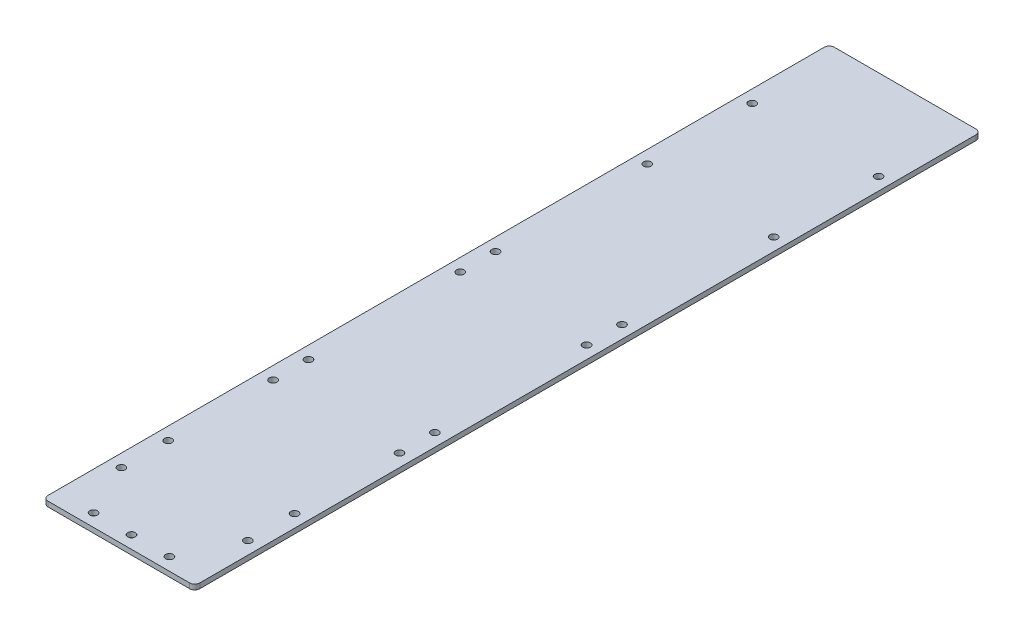
ISO-10303-21;
HEADER;
FILE_DESCRIPTION(('STEP AP214'),'2;1');
FILE_NAME('part.step','',(''),(''),'','','');
FILE_SCHEMA(('AUTOMOTIVE_DESIGN { 1 0 10303 214 1 1 1 1 }'));
ENDSEC;
DATA;
#1=APPLICATION_CONTEXT('core data for automotive mechanical design processes');
#2=APPLICATION_PROTOCOL_DEFINITION('international standard','automotive_design',2000,#1);
#3=PRODUCT_CONTEXT('',#1,'mechanical');
#4=PRODUCT('Part','Part','',(#3));
#5=PRODUCT_RELATED_PRODUCT_CATEGORY('part','',(#4));
#6=PRODUCT_DEFINITION_FORMATION('','',#4);
#7=PRODUCT_DEFINITION_CONTEXT('part definition',#1,'design');
#8=PRODUCT_DEFINITION('design','',#6,#7);
#9=PRODUCT_DEFINITION_SHAPE('','',#8);
#10=(LENGTH_UNIT() NAMED_UNIT(*) SI_UNIT(.MILLI.,.METRE.));
#11=(NAMED_UNIT(*) PLANE_ANGLE_UNIT() SI_UNIT($,.RADIAN.));
#12=(NAMED_UNIT(*) SI_UNIT($,.STERADIAN.) SOLID_ANGLE_UNIT());
#13=UNCERTAINTY_MEASURE_WITH_UNIT(LENGTH_MEASURE(1.E-05),#10,'distance_accuracy_value','');
#14=(GEOMETRIC_REPRESENTATION_CONTEXT(3) GLOBAL_UNCERTAINTY_ASSIGNED_CONTEXT((#13)) GLOBAL_UNIT_ASSIGNED_CONTEXT((#10,
#11,#12)) REPRESENTATION_CONTEXT('',''));
#15=CARTESIAN_POINT('',(0.,0.,0.));
#16=DIRECTION('',(0.,0.,1.));
#17=DIRECTION('',(1.,0.,0.));
#18=AXIS2_PLACEMENT_3D('',#15,#16,#17);
#19=CARTESIAN_POINT('',(-30.,2.,135.));
#20=DIRECTION('',(1.,0.,0.));
#21=DIRECTION('',(0.,0.,-1.));
#22=AXIS2_PLACEMENT_3D('',#19,#20,#21);
#23=PLANE('',#22);
#24=DIRECTION('',(0.,0.,1.));
#25=VECTOR('',#24,1.);
#26=CARTESIAN_POINT('',(-30.,0.,135.));
#27=LINE('',#26,#25);
#28=CARTESIAN_POINT('',(-30.,0.,-174.));
#29=VERTEX_POINT('',#28);
#30=CARTESIAN_POINT('',(-30.,0.,133.));
#31=VERTEX_POINT('',#30);
#32=EDGE_CURVE('E128',#29,#31,#27,.T.);
#33=ORIENTED_EDGE('',*,*,#32,.T.);
#34=DIRECTION('',(0.,-1.,0.));
#35=VECTOR('',#34,1.);
#36=CARTESIAN_POINT('',(-30.,2.,133.));
#37=LINE('',#36,#35);
#38=CARTESIAN_POINT('',(-30.,2.,133.));
#39=VERTEX_POINT('',#38);
#40=EDGE_CURVE('E106',#31,#39,#37,.F.);
#41=ORIENTED_EDGE('',*,*,#40,.T.);
#42=DIRECTION('',(0.,0.,1.));
#43=VECTOR('',#42,1.);
#44=CARTESIAN_POINT('',(-30.,2.,135.));
#45=LINE('',#44,#43);
#46=CARTESIAN_POINT('',(-30.,2.,-174.));
#47=VERTEX_POINT('',#46);
#48=EDGE_CURVE('E138',#47,#39,#45,.T.);
#49=ORIENTED_EDGE('',*,*,#48,.F.);
#50=DIRECTION('',(0.,-1.,0.));
#51=VECTOR('',#50,1.);
#52=CARTESIAN_POINT('',(-30.,2.,-174.));
#53=LINE('',#52,#51);
#54=EDGE_CURVE('E111',#47,#29,#53,.T.);
#55=ORIENTED_EDGE('',*,*,#54,.T.);
#56=EDGE_LOOP('',(#33,#41,#49,#55));
#57=FACE_BOUND('',#56,.T.);
#58=ADVANCED_FACE('F35',(#57),#23,.F.);
#59=CARTESIAN_POINT('',(-30.,2.,135.));
#60=DIRECTION('',(0.,0.,-1.));
#61=DIRECTION('',(-1.,0.,0.));
#62=AXIS2_PLACEMENT_3D('',#59,#60,#61);
#63=PLANE('',#62);
#64=DIRECTION('',(1.,0.,0.));
#65=VECTOR('',#64,1.);
#66=CARTESIAN_POINT('',(-30.,2.,135.));
#67=LINE('',#66,#65);
#68=CARTESIAN_POINT('',(-28.,2.,135.));
#69=VERTEX_POINT('',#68);
#70=CARTESIAN_POINT('',(28.,2.,135.));
#71=VERTEX_POINT('',#70);
#72=EDGE_CURVE('E121',#69,#71,#67,.T.);
#73=ORIENTED_EDGE('',*,*,#72,.F.);
#74=DIRECTION('',(0.,-1.,0.));
#75=VECTOR('',#74,1.);
#76=CARTESIAN_POINT('',(-28.,2.,135.));
#77=LINE('',#76,#75);
#78=CARTESIAN_POINT('',(-28.,0.,135.));
#79=VERTEX_POINT('',#78);
#80=EDGE_CURVE('E105',#69,#79,#77,.T.);
#81=ORIENTED_EDGE('',*,*,#80,.T.);
#82=DIRECTION('',(1.,0.,0.));
#83=VECTOR('',#82,1.);
#84=CARTESIAN_POINT('',(-30.,0.,135.));
#85=LINE('',#84,#83);
#86=CARTESIAN_POINT('',(28.,0.,135.));
#87=VERTEX_POINT('',#86);
#88=EDGE_CURVE('E118',#79,#87,#85,.T.);
#89=ORIENTED_EDGE('',*,*,#88,.T.);
#90=DIRECTION('',(0.,-1.,0.));
#91=VECTOR('',#90,1.);
#92=CARTESIAN_POINT('',(28.,2.,135.));
#93=LINE('',#92,#91);
#94=EDGE_CURVE('E123',#87,#71,#93,.F.);
#95=ORIENTED_EDGE('',*,*,#94,.T.);
#96=EDGE_LOOP('',(#73,#81,#89,#95));
#97=FACE_BOUND('',#96,.T.);
#98=ADVANCED_FACE('F117',(#97),#63,.F.);
#99=CARTESIAN_POINT('',(30.,2.,135.));
#100=DIRECTION('',(-1.,0.,0.));
#101=DIRECTION('',(0.,0.,1.));
#102=AXIS2_PLACEMENT_3D('',#99,#100,#101);
#103=PLANE('',#102);
#104=DIRECTION('',(0.,0.,-1.));
#105=VECTOR('',#104,1.);
#106=CARTESIAN_POINT('',(30.,2.,135.));
#107=LINE('',#106,#105);
#108=CARTESIAN_POINT('',(30.,2.,133.));
#109=VERTEX_POINT('',#108);
#110=CARTESIAN_POINT('',(30.,2.,-174.));
#111=VERTEX_POINT('',#110);
#112=EDGE_CURVE('E164',#109,#111,#107,.T.);
#113=ORIENTED_EDGE('',*,*,#112,.F.);
#114=DIRECTION('',(0.,-1.,0.));
#115=VECTOR('',#114,1.);
#116=CARTESIAN_POINT('',(30.,2.,133.));
#117=LINE('',#116,#115);
#118=CARTESIAN_POINT('',(30.,0.,133.));
#119=VERTEX_POINT('',#118);
#120=EDGE_CURVE('E157',#109,#119,#117,.T.);
#121=ORIENTED_EDGE('',*,*,#120,.T.);
#122=DIRECTION('',(0.,0.,-1.));
#123=VECTOR('',#122,1.);
#124=CARTESIAN_POINT('',(30.,0.,135.));
#125=LINE('',#124,#123);
#126=CARTESIAN_POINT('',(30.,0.,-174.));
#127=VERTEX_POINT('',#126);
#128=EDGE_CURVE('E127',#119,#127,#125,.T.);
#129=ORIENTED_EDGE('',*,*,#128,.T.);
#130=DIRECTION('',(0.,-1.,0.));
#131=VECTOR('',#130,1.);
#132=CARTESIAN_POINT('',(30.,2.,-174.));
#133=LINE('',#132,#131);
#134=EDGE_CURVE('E155',#127,#111,#133,.F.);
#135=ORIENTED_EDGE('',*,*,#134,.T.);
#136=EDGE_LOOP('',(#113,#121,#129,#135));
#137=FACE_BOUND('',#136,.T.);
#138=ADVANCED_FACE('F162',(#137),#103,.F.);
#139=CARTESIAN_POINT('',(-30.,2.,-176.));
#140=DIRECTION('',(0.,0.,1.));
#141=DIRECTION('',(1.,0.,0.));
#142=AXIS2_PLACEMENT_3D('',#139,#140,#141);
#143=PLANE('',#142);
#144=DIRECTION('',(-1.,0.,0.));
#145=VECTOR('',#144,1.);
#146=CARTESIAN_POINT('',(-30.,2.,-176.));
#147=LINE('',#146,#145);
#148=CARTESIAN_POINT('',(28.,2.,-176.));
#149=VERTEX_POINT('',#148);
#150=CARTESIAN_POINT('',(-28.,2.,-176.));
#151=VERTEX_POINT('',#150);
#152=EDGE_CURVE('E139',#149,#151,#147,.T.);
#153=ORIENTED_EDGE('',*,*,#152,.F.);
#154=DIRECTION('',(0.,-1.,0.));
#155=VECTOR('',#154,1.);
#156=CARTESIAN_POINT('',(28.,2.,-176.));
#157=LINE('',#156,#155);
#158=CARTESIAN_POINT('',(28.,0.,-176.));
#159=VERTEX_POINT('',#158);
#160=EDGE_CURVE('E11',#149,#159,#157,.T.);
#161=ORIENTED_EDGE('',*,*,#160,.T.);
#162=DIRECTION('',(-1.,0.,0.));
#163=VECTOR('',#162,1.);
#164=CARTESIAN_POINT('',(-30.,0.,-176.));
#165=LINE('',#164,#163);
#166=CARTESIAN_POINT('',(-28.,0.,-176.));
#167=VERTEX_POINT('',#166);
#168=EDGE_CURVE('E131',#159,#167,#165,.T.);
#169=ORIENTED_EDGE('',*,*,#168,.T.);
#170=DIRECTION('',(0.,-1.,0.));
#171=VECTOR('',#170,1.);
#172=CARTESIAN_POINT('',(-28.,2.,-176.));
#173=LINE('',#172,#171);
#174=EDGE_CURVE('E43',#167,#151,#173,.F.);
#175=ORIENTED_EDGE('',*,*,#174,.T.);
#176=EDGE_LOOP('',(#153,#161,#169,#175));
#177=FACE_BOUND('',#176,.T.);
#178=ADVANCED_FACE('F171',(#177),#143,.F.);
#179=CARTESIAN_POINT('',(0.,2.,0.));
#180=DIRECTION('',(0.,-1.,0.));
#181=DIRECTION('',(0.,0.,-1.));
#182=AXIS2_PLACEMENT_3D('',#179,#180,#181);
#183=PLANE('',#182);
#184=CARTESIAN_POINT('',(15.,2.,130.));
#185=DIRECTION('',(0.,1.,0.));
#186=DIRECTION('',(0.,0.,1.));
#187=AXIS2_PLACEMENT_3D('',#184,#185,#186);
#188=CIRCLE('',#187,1.49999999999999);
#189=CARTESIAN_POINT('',(15.,2.,131.5));
#190=VERTEX_POINT('',#189);
#191=EDGE_CURVE('E286',#190,#190,#188,.T.);
#192=ORIENTED_EDGE('',*,*,#191,.F.);
#193=EDGE_LOOP('',(#192));
#194=FACE_BOUND('',#193,.T.);
#195=CARTESIAN_POINT('',(0.,2.,130.));
#196=DIRECTION('',(0.,1.,0.));
#197=DIRECTION('',(0.,0.,1.));
#198=AXIS2_PLACEMENT_3D('',#195,#196,#197);
#199=CIRCLE('',#198,1.5);
#200=CARTESIAN_POINT('',(0.,2.,131.5));
#201=VERTEX_POINT('',#200);
#202=EDGE_CURVE('E280',#201,#201,#199,.T.);
#203=ORIENTED_EDGE('',*,*,#202,.F.);
#204=EDGE_LOOP('',(#203));
#205=FACE_BOUND('',#204,.T.);
#206=CARTESIAN_POINT('',(-15.,2.,130.));
#207=DIRECTION('',(0.,1.,0.));
#208=DIRECTION('',(0.,0.,1.));
#209=AXIS2_PLACEMENT_3D('',#206,#207,#208);
#210=CIRCLE('',#209,1.5);
#211=CARTESIAN_POINT('',(-15.,2.,131.5));
#212=VERTEX_POINT('',#211);
#213=EDGE_CURVE('E274',#212,#212,#210,.T.);
#214=ORIENTED_EDGE('',*,*,#213,.F.);
#215=EDGE_LOOP('',(#214));
#216=FACE_BOUND('',#215,.T.);
#217=CARTESIAN_POINT('',(25.,2.,90.5));
#218=DIRECTION('',(0.,1.,0.));
#219=DIRECTION('',(0.,0.,1.));
#220=AXIS2_PLACEMENT_3D('',#217,#218,#219);
#221=CIRCLE('',#220,1.5);
#222=CARTESIAN_POINT('',(25.,2.,92.));
#223=VERTEX_POINT('',#222);
#224=EDGE_CURVE('E269',#223,#223,#221,.T.);
#225=ORIENTED_EDGE('',*,*,#224,.F.);
#226=EDGE_LOOP('',(#225));
#227=FACE_BOUND('',#226,.T.);
#228=CARTESIAN_POINT('',(-25.,2.,-140.5));
#229=DIRECTION('',(0.,1.,0.));
#230=DIRECTION('',(0.,0.,1.));
#231=AXIS2_PLACEMENT_3D('',#228,#229,#230);
#232=CIRCLE('',#231,1.5);
#233=CARTESIAN_POINT('',(-25.,2.,-139.));
#234=VERTEX_POINT('',#233);
#235=EDGE_CURVE('E263',#234,#234,#232,.T.);
#236=ORIENTED_EDGE('',*,*,#235,.F.);
#237=EDGE_LOOP('',(#236));
#238=FACE_BOUND('',#237,.T.);
#239=CARTESIAN_POINT('',(25.,2.,-140.5));
#240=DIRECTION('',(0.,1.,0.));
#241=DIRECTION('',(0.,0.,1.));
#242=AXIS2_PLACEMENT_3D('',#239,#240,#241);
#243=CIRCLE('',#242,1.5);
#244=CARTESIAN_POINT('',(25.,2.,-139.));
#245=VERTEX_POINT('',#244);
#246=EDGE_CURVE('E256',#245,#245,#243,.T.);
#247=ORIENTED_EDGE('',*,*,#246,.F.);
#248=EDGE_LOOP('',(#247));
#249=FACE_BOUND('',#248,.T.);
#250=CARTESIAN_POINT('',(-25.,2.,90.5));
#251=DIRECTION('',(0.,1.,0.));
#252=DIRECTION('',(0.,0.,1.));
#253=AXIS2_PLACEMENT_3D('',#250,#251,#252);
#254=CIRCLE('',#253,1.5);
#255=CARTESIAN_POINT('',(-25.,2.,92.));
#256=VERTEX_POINT('',#255);
#257=EDGE_CURVE('E250',#256,#256,#254,.T.);
#258=ORIENTED_EDGE('',*,*,#257,.F.);
#259=EDGE_LOOP('',(#258));
#260=FACE_BOUND('',#259,.T.);
#261=CARTESIAN_POINT('',(25.,2.,-25.));
#262=DIRECTION('',(0.,1.,0.));
#263=DIRECTION('',(0.,0.,1.));
#264=AXIS2_PLACEMENT_3D('',#261,#262,#263);
#265=CIRCLE('',#264,1.5);
#266=CARTESIAN_POINT('',(25.,2.,-23.5));
#267=VERTEX_POINT('',#266);
#268=EDGE_CURVE('E203',#267,#267,#265,.T.);
#269=ORIENTED_EDGE('',*,*,#268,.F.);
#270=EDGE_LOOP('',(#269));
#271=FACE_BOUND('',#270,.T.);
#272=CARTESIAN_POINT('',(-25.,2.,-25.));
#273=DIRECTION('',(0.,1.,0.));
#274=DIRECTION('',(0.,0.,1.));
#275=AXIS2_PLACEMENT_3D('',#272,#273,#274);
#276=CIRCLE('',#275,1.5);
#277=CARTESIAN_POINT('',(-25.,2.,-23.5));
#278=VERTEX_POINT('',#277);
#279=EDGE_CURVE('E239',#278,#278,#276,.T.);
#280=ORIENTED_EDGE('',*,*,#279,.F.);
#281=EDGE_LOOP('',(#280));
#282=FACE_BOUND('',#281,.T.);
#283=CARTESIAN_POINT('',(-25.,2.,-39.));
#284=DIRECTION('',(0.,1.,0.));
#285=DIRECTION('',(0.,0.,1.));
#286=AXIS2_PLACEMENT_3D('',#283,#284,#285);
#287=CIRCLE('',#286,1.5);
#288=CARTESIAN_POINT('',(-25.,2.,-37.5));
#289=VERTEX_POINT('',#288);
#290=EDGE_CURVE('E245',#289,#289,#287,.T.);
#291=ORIENTED_EDGE('',*,*,#290,.F.);
#292=EDGE_LOOP('',(#291));
#293=FACE_BOUND('',#292,.T.);
#294=CARTESIAN_POINT('',(25.,2.,-39.));
#295=DIRECTION('',(0.,1.,0.));
#296=DIRECTION('',(0.,0.,1.));
#297=AXIS2_PLACEMENT_3D('',#294,#295,#296);
#298=CIRCLE('',#297,1.5);
#299=CARTESIAN_POINT('',(25.,2.,-37.5));
#300=VERTEX_POINT('',#299);
#301=EDGE_CURVE('E222',#300,#300,#298,.T.);
#302=ORIENTED_EDGE('',*,*,#301,.F.);
#303=EDGE_LOOP('',(#302));
#304=FACE_BOUND('',#303,.T.);
#305=CARTESIAN_POINT('',(25.,2.,-99.));
#306=DIRECTION('',(0.,1.,0.));
#307=DIRECTION('',(0.,0.,1.));
#308=AXIS2_PLACEMENT_3D('',#305,#306,#307);
#309=CIRCLE('',#308,1.5);
#310=CARTESIAN_POINT('',(25.,2.,-97.5));
#311=VERTEX_POINT('',#310);
#312=EDGE_CURVE('E229',#311,#311,#309,.T.);
#313=ORIENTED_EDGE('',*,*,#312,.F.);
#314=EDGE_LOOP('',(#313));
#315=FACE_BOUND('',#314,.T.);
#316=CARTESIAN_POINT('',(-25.,2.,109.));
#317=DIRECTION('',(0.,1.,0.));
#318=DIRECTION('',(0.,0.,1.));
#319=AXIS2_PLACEMENT_3D('',#316,#317,#318);
#320=CIRCLE('',#319,1.5);
#321=CARTESIAN_POINT('',(-25.,2.,110.5));
#322=VERTEX_POINT('',#321);
#323=EDGE_CURVE('E204',#322,#322,#320,.T.);
#324=ORIENTED_EDGE('',*,*,#323,.F.);
#325=EDGE_LOOP('',(#324));
#326=FACE_BOUND('',#325,.T.);
#327=CARTESIAN_POINT('',(25.,2.,109.));
#328=DIRECTION('',(0.,1.,0.));
#329=DIRECTION('',(0.,0.,1.));
#330=AXIS2_PLACEMENT_3D('',#327,#328,#329);
#331=CIRCLE('',#330,1.5);
#332=CARTESIAN_POINT('',(25.,2.,110.5));
#333=VERTEX_POINT('',#332);
#334=EDGE_CURVE('E211',#333,#333,#331,.T.);
#335=ORIENTED_EDGE('',*,*,#334,.F.);
#336=EDGE_LOOP('',(#335));
#337=FACE_BOUND('',#336,.T.);
#338=CARTESIAN_POINT('',(-25.,2.,49.));
#339=DIRECTION('',(0.,1.,0.));
#340=DIRECTION('',(0.,0.,1.));
#341=AXIS2_PLACEMENT_3D('',#338,#339,#340);
#342=CIRCLE('',#341,1.5);
#343=CARTESIAN_POINT('',(-25.,2.,50.5));
#344=VERTEX_POINT('',#343);
#345=EDGE_CURVE('E217',#344,#344,#342,.T.);
#346=ORIENTED_EDGE('',*,*,#345,.F.);
#347=EDGE_LOOP('',(#346));
#348=FACE_BOUND('',#347,.T.);
#349=CARTESIAN_POINT('',(25.,2.,49.));
#350=DIRECTION('',(0.,1.,0.));
#351=DIRECTION('',(0.,0.,1.));
#352=AXIS2_PLACEMENT_3D('',#349,#350,#351);
#353=CIRCLE('',#352,1.5);
#354=CARTESIAN_POINT('',(25.,2.,50.5));
#355=VERTEX_POINT('',#354);
#356=EDGE_CURVE('E184',#355,#355,#353,.T.);
#357=ORIENTED_EDGE('',*,*,#356,.F.);
#358=EDGE_LOOP('',(#357));
#359=FACE_BOUND('',#358,.T.);
#360=CARTESIAN_POINT('',(25.,2.,35.));
#361=DIRECTION('',(0.,1.,0.));
#362=DIRECTION('',(0.,0.,1.));
#363=AXIS2_PLACEMENT_3D('',#360,#361,#362);
#364=CIRCLE('',#363,1.5);
#365=CARTESIAN_POINT('',(25.,2.,36.5));
#366=VERTEX_POINT('',#365);
#367=EDGE_CURVE('E191',#366,#366,#364,.T.);
#368=ORIENTED_EDGE('',*,*,#367,.F.);
#369=EDGE_LOOP('',(#368));
#370=FACE_BOUND('',#369,.T.);
#371=CARTESIAN_POINT('',(-25.,2.,35.));
#372=DIRECTION('',(0.,1.,0.));
#373=DIRECTION('',(0.,0.,1.));
#374=AXIS2_PLACEMENT_3D('',#371,#372,#373);
#375=CIRCLE('',#374,1.5);
#376=CARTESIAN_POINT('',(-25.,2.,36.5));
#377=VERTEX_POINT('',#376);
#378=EDGE_CURVE('E197',#377,#377,#375,.T.);
#379=ORIENTED_EDGE('',*,*,#378,.F.);
#380=EDGE_LOOP('',(#379));
#381=FACE_BOUND('',#380,.T.);
#382=CARTESIAN_POINT('',(-25.,2.,-99.));
#383=DIRECTION('',(0.,1.,0.));
#384=DIRECTION('',(0.,0.,1.));
#385=AXIS2_PLACEMENT_3D('',#382,#383,#384);
#386=CIRCLE('',#385,1.5);
#387=CARTESIAN_POINT('',(-25.,2.,-97.5));
#388=VERTEX_POINT('',#387);
#389=EDGE_CURVE('E178',#388,#388,#386,.T.);
#390=ORIENTED_EDGE('',*,*,#389,.F.);
#391=EDGE_LOOP('',(#390));
#392=FACE_BOUND('',#391,.T.);
#393=ORIENTED_EDGE('',*,*,#48,.T.);
#394=CARTESIAN_POINT('',(-28.,2.,133.));
#395=DIRECTION('',(0.,-1.,0.));
#396=DIRECTION('',(0.,0.,-1.));
#397=AXIS2_PLACEMENT_3D('',#394,#395,#396);
#398=CIRCLE('',#397,2.);
#399=EDGE_CURVE('E153',#39,#69,#398,.F.);
#400=ORIENTED_EDGE('',*,*,#399,.T.);
#401=ORIENTED_EDGE('',*,*,#72,.T.);
#402=CARTESIAN_POINT('',(28.,2.,133.));
#403=DIRECTION('',(0.,-1.,0.));
#404=DIRECTION('',(0.,0.,-1.));
#405=AXIS2_PLACEMENT_3D('',#402,#403,#404);
#406=CIRCLE('',#405,2.);
#407=EDGE_CURVE('E151',#71,#109,#406,.F.);
#408=ORIENTED_EDGE('',*,*,#407,.T.);
#409=ORIENTED_EDGE('',*,*,#112,.T.);
#410=CARTESIAN_POINT('',(28.,2.,-174.));
#411=DIRECTION('',(0.,-1.,0.));
#412=DIRECTION('',(0.,0.,-1.));
#413=AXIS2_PLACEMENT_3D('',#410,#411,#412);
#414=CIRCLE('',#413,2.);
#415=EDGE_CURVE('E56',#111,#149,#414,.F.);
#416=ORIENTED_EDGE('',*,*,#415,.T.);
#417=ORIENTED_EDGE('',*,*,#152,.T.);
#418=CARTESIAN_POINT('',(-28.,2.,-174.));
#419=DIRECTION('',(0.,-1.,0.));
#420=DIRECTION('',(0.,0.,-1.));
#421=AXIS2_PLACEMENT_3D('',#418,#419,#420);
#422=CIRCLE('',#421,2.);
#423=EDGE_CURVE('E148',#151,#47,#422,.F.);
#424=ORIENTED_EDGE('',*,*,#423,.T.);
#425=EDGE_LOOP('',(#393,#400,#401,#408,#409,#416,#417,#424));
#426=FACE_BOUND('',#425,.T.);
#427=ADVANCED_FACE('F301',(#194,#205,#216,#227,#238,#249,#260,#271,#282,#293,#304,#315,#326,
#337,#348,#359,#370,#381,#392,#426),#183,.F.);
#428=CARTESIAN_POINT('',(0.,0.,0.));
#429=DIRECTION('',(0.,-1.,0.));
#430=DIRECTION('',(0.,0.,-1.));
#431=AXIS2_PLACEMENT_3D('',#428,#429,#430);
#432=PLANE('',#431);
#433=CARTESIAN_POINT('',(15.,0.,130.));
#434=DIRECTION('',(0.,1.,0.));
#435=DIRECTION('',(0.,0.,1.));
#436=AXIS2_PLACEMENT_3D('',#433,#434,#435);
#437=CIRCLE('',#436,1.49999999999999);
#438=CARTESIAN_POINT('',(15.,0.,131.5));
#439=VERTEX_POINT('',#438);
#440=EDGE_CURVE('E277',#439,#439,#437,.T.);
#441=ORIENTED_EDGE('',*,*,#440,.T.);
#442=EDGE_LOOP('',(#441));
#443=FACE_BOUND('',#442,.T.);
#444=CARTESIAN_POINT('',(0.,0.,130.));
#445=DIRECTION('',(0.,1.,0.));
#446=DIRECTION('',(0.,0.,1.));
#447=AXIS2_PLACEMENT_3D('',#444,#445,#446);
#448=CIRCLE('',#447,1.5);
#449=CARTESIAN_POINT('',(0.,0.,131.5));
#450=VERTEX_POINT('',#449);
#451=EDGE_CURVE('E283',#450,#450,#448,.T.);
#452=ORIENTED_EDGE('',*,*,#451,.T.);
#453=EDGE_LOOP('',(#452));
#454=FACE_BOUND('',#453,.T.);
#455=CARTESIAN_POINT('',(-15.,0.,130.));
#456=DIRECTION('',(0.,1.,0.));
#457=DIRECTION('',(0.,0.,1.));
#458=AXIS2_PLACEMENT_3D('',#455,#456,#457);
#459=CIRCLE('',#458,1.5);
#460=CARTESIAN_POINT('',(-15.,0.,131.5));
#461=VERTEX_POINT('',#460);
#462=EDGE_CURVE('E260',#461,#461,#459,.T.);
#463=ORIENTED_EDGE('',*,*,#462,.T.);
#464=EDGE_LOOP('',(#463));
#465=FACE_BOUND('',#464,.T.);
#466=CARTESIAN_POINT('',(25.,0.,90.5));
#467=DIRECTION('',(0.,1.,0.));
#468=DIRECTION('',(0.,0.,1.));
#469=AXIS2_PLACEMENT_3D('',#466,#467,#468);
#470=CIRCLE('',#469,1.5);
#471=CARTESIAN_POINT('',(25.,0.,92.));
#472=VERTEX_POINT('',#471);
#473=EDGE_CURVE('E253',#472,#472,#470,.T.);
#474=ORIENTED_EDGE('',*,*,#473,.T.);
#475=EDGE_LOOP('',(#474));
#476=FACE_BOUND('',#475,.T.);
#477=CARTESIAN_POINT('',(-25.,0.,-140.5));
#478=DIRECTION('',(0.,1.,0.));
#479=DIRECTION('',(0.,0.,1.));
#480=AXIS2_PLACEMENT_3D('',#477,#478,#479);
#481=CIRCLE('',#480,1.5);
#482=CARTESIAN_POINT('',(-25.,0.,-139.));
#483=VERTEX_POINT('',#482);
#484=EDGE_CURVE('E266',#483,#483,#481,.T.);
#485=ORIENTED_EDGE('',*,*,#484,.T.);
#486=EDGE_LOOP('',(#485));
#487=FACE_BOUND('',#486,.T.);
#488=CARTESIAN_POINT('',(25.,0.,-140.5));
#489=DIRECTION('',(0.,1.,0.));
#490=DIRECTION('',(0.,0.,1.));
#491=AXIS2_PLACEMENT_3D('',#488,#489,#490);
#492=CIRCLE('',#491,1.5);
#493=CARTESIAN_POINT('',(25.,0.,-139.));
#494=VERTEX_POINT('',#493);
#495=EDGE_CURVE('E259',#494,#494,#492,.T.);
#496=ORIENTED_EDGE('',*,*,#495,.T.);
#497=EDGE_LOOP('',(#496));
#498=FACE_BOUND('',#497,.T.);
#499=CARTESIAN_POINT('',(-25.,0.,90.5));
#500=DIRECTION('',(0.,1.,0.));
#501=DIRECTION('',(0.,0.,1.));
#502=AXIS2_PLACEMENT_3D('',#499,#500,#501);
#503=CIRCLE('',#502,1.5);
#504=CARTESIAN_POINT('',(-25.,0.,92.));
#505=VERTEX_POINT('',#504);
#506=EDGE_CURVE('E208',#505,#505,#503,.T.);
#507=ORIENTED_EDGE('',*,*,#506,.T.);
#508=EDGE_LOOP('',(#507));
#509=FACE_BOUND('',#508,.T.);
#510=CARTESIAN_POINT('',(25.,0.,-25.));
#511=DIRECTION('',(0.,1.,0.));
#512=DIRECTION('',(0.,0.,1.));
#513=AXIS2_PLACEMENT_3D('',#510,#511,#512);
#514=CIRCLE('',#513,1.5);
#515=CARTESIAN_POINT('',(25.,0.,-23.5));
#516=VERTEX_POINT('',#515);
#517=EDGE_CURVE('E236',#516,#516,#514,.T.);
#518=ORIENTED_EDGE('',*,*,#517,.T.);
#519=EDGE_LOOP('',(#518));
#520=FACE_BOUND('',#519,.T.);
#521=CARTESIAN_POINT('',(-25.,0.,-25.));
#522=DIRECTION('',(0.,1.,0.));
#523=DIRECTION('',(0.,0.,1.));
#524=AXIS2_PLACEMENT_3D('',#521,#522,#523);
#525=CIRCLE('',#524,1.5);
#526=CARTESIAN_POINT('',(-25.,0.,-23.5));
#527=VERTEX_POINT('',#526);
#528=EDGE_CURVE('E242',#527,#527,#525,.T.);
#529=ORIENTED_EDGE('',*,*,#528,.T.);
#530=EDGE_LOOP('',(#529));
#531=FACE_BOUND('',#530,.T.);
#532=CARTESIAN_POINT('',(-25.,0.,-39.));
#533=DIRECTION('',(0.,1.,0.));
#534=DIRECTION('',(0.,0.,1.));
#535=AXIS2_PLACEMENT_3D('',#532,#533,#534);
#536=CIRCLE('',#535,1.5);
#537=CARTESIAN_POINT('',(-25.,0.,-37.5));
#538=VERTEX_POINT('',#537);
#539=EDGE_CURVE('E226',#538,#538,#536,.T.);
#540=ORIENTED_EDGE('',*,*,#539,.T.);
#541=EDGE_LOOP('',(#540));
#542=FACE_BOUND('',#541,.T.);
#543=CARTESIAN_POINT('',(25.,0.,-39.));
#544=DIRECTION('',(0.,1.,0.));
#545=DIRECTION('',(0.,0.,1.));
#546=AXIS2_PLACEMENT_3D('',#543,#544,#545);
#547=CIRCLE('',#546,1.5);
#548=CARTESIAN_POINT('',(25.,0.,-37.5));
#549=VERTEX_POINT('',#548);
#550=EDGE_CURVE('E225',#549,#549,#547,.T.);
#551=ORIENTED_EDGE('',*,*,#550,.T.);
#552=EDGE_LOOP('',(#551));
#553=FACE_BOUND('',#552,.T.);
#554=CARTESIAN_POINT('',(25.,0.,-99.));
#555=DIRECTION('',(0.,1.,0.));
#556=DIRECTION('',(0.,0.,1.));
#557=AXIS2_PLACEMENT_3D('',#554,#555,#556);
#558=CIRCLE('',#557,1.5);
#559=CARTESIAN_POINT('',(25.,0.,-97.5));
#560=VERTEX_POINT('',#559);
#561=EDGE_CURVE('E181',#560,#560,#558,.T.);
#562=ORIENTED_EDGE('',*,*,#561,.T.);
#563=EDGE_LOOP('',(#562));
#564=FACE_BOUND('',#563,.T.);
#565=CARTESIAN_POINT('',(-25.,0.,109.));
#566=DIRECTION('',(0.,1.,0.));
#567=DIRECTION('',(0.,0.,1.));
#568=AXIS2_PLACEMENT_3D('',#565,#566,#567);
#569=CIRCLE('',#568,1.5);
#570=CARTESIAN_POINT('',(-25.,0.,110.5));
#571=VERTEX_POINT('',#570);
#572=EDGE_CURVE('E207',#571,#571,#569,.T.);
#573=ORIENTED_EDGE('',*,*,#572,.T.);
#574=EDGE_LOOP('',(#573));
#575=FACE_BOUND('',#574,.T.);
#576=CARTESIAN_POINT('',(25.,0.,109.));
#577=DIRECTION('',(0.,1.,0.));
#578=DIRECTION('',(0.,0.,1.));
#579=AXIS2_PLACEMENT_3D('',#576,#577,#578);
#580=CIRCLE('',#579,1.5);
#581=CARTESIAN_POINT('',(25.,0.,110.5));
#582=VERTEX_POINT('',#581);
#583=EDGE_CURVE('E214',#582,#582,#580,.T.);
#584=ORIENTED_EDGE('',*,*,#583,.T.);
#585=EDGE_LOOP('',(#584));
#586=FACE_BOUND('',#585,.T.);
#587=CARTESIAN_POINT('',(-25.,0.,49.));
#588=DIRECTION('',(0.,1.,0.));
#589=DIRECTION('',(0.,0.,1.));
#590=AXIS2_PLACEMENT_3D('',#587,#588,#589);
#591=CIRCLE('',#590,1.5);
#592=CARTESIAN_POINT('',(-25.,0.,50.5));
#593=VERTEX_POINT('',#592);
#594=EDGE_CURVE('E188',#593,#593,#591,.T.);
#595=ORIENTED_EDGE('',*,*,#594,.T.);
#596=EDGE_LOOP('',(#595));
#597=FACE_BOUND('',#596,.T.);
#598=CARTESIAN_POINT('',(25.,0.,49.));
#599=DIRECTION('',(0.,1.,0.));
#600=DIRECTION('',(0.,0.,1.));
#601=AXIS2_PLACEMENT_3D('',#598,#599,#600);
#602=CIRCLE('',#601,1.5);
#603=CARTESIAN_POINT('',(25.,0.,50.5));
#604=VERTEX_POINT('',#603);
#605=EDGE_CURVE('E187',#604,#604,#602,.T.);
#606=ORIENTED_EDGE('',*,*,#605,.T.);
#607=EDGE_LOOP('',(#606));
#608=FACE_BOUND('',#607,.T.);
#609=CARTESIAN_POINT('',(25.,0.,35.));
#610=DIRECTION('',(0.,1.,0.));
#611=DIRECTION('',(0.,0.,1.));
#612=AXIS2_PLACEMENT_3D('',#609,#610,#611);
#613=CIRCLE('',#612,1.5);
#614=CARTESIAN_POINT('',(25.,0.,36.5));
#615=VERTEX_POINT('',#614);
#616=EDGE_CURVE('E194',#615,#615,#613,.T.);
#617=ORIENTED_EDGE('',*,*,#616,.T.);
#618=EDGE_LOOP('',(#617));
#619=FACE_BOUND('',#618,.T.);
#620=CARTESIAN_POINT('',(-25.,0.,35.));
#621=DIRECTION('',(0.,1.,0.));
#622=DIRECTION('',(0.,0.,1.));
#623=AXIS2_PLACEMENT_3D('',#620,#621,#622);
#624=CIRCLE('',#623,1.5);
#625=CARTESIAN_POINT('',(-25.,0.,36.5));
#626=VERTEX_POINT('',#625);
#627=EDGE_CURVE('E200',#626,#626,#624,.T.);
#628=ORIENTED_EDGE('',*,*,#627,.T.);
#629=EDGE_LOOP('',(#628));
#630=FACE_BOUND('',#629,.T.);
#631=CARTESIAN_POINT('',(-25.,0.,-99.));
#632=DIRECTION('',(0.,1.,0.));
#633=DIRECTION('',(0.,0.,1.));
#634=AXIS2_PLACEMENT_3D('',#631,#632,#633);
#635=CIRCLE('',#634,1.5);
#636=CARTESIAN_POINT('',(-25.,0.,-97.5));
#637=VERTEX_POINT('',#636);
#638=EDGE_CURVE('E133',#637,#637,#635,.T.);
#639=ORIENTED_EDGE('',*,*,#638,.T.);
#640=EDGE_LOOP('',(#639));
#641=FACE_BOUND('',#640,.T.);
#642=ORIENTED_EDGE('',*,*,#88,.F.);
#643=CARTESIAN_POINT('',(-28.,0.,133.));
#644=DIRECTION('',(0.,-1.,0.));
#645=DIRECTION('',(0.,0.,-1.));
#646=AXIS2_PLACEMENT_3D('',#643,#644,#645);
#647=CIRCLE('',#646,2.);
#648=EDGE_CURVE('E101',#79,#31,#647,.T.);
#649=ORIENTED_EDGE('',*,*,#648,.T.);
#650=ORIENTED_EDGE('',*,*,#32,.F.);
#651=CARTESIAN_POINT('',(-28.,0.,-174.));
#652=DIRECTION('',(0.,-1.,0.));
#653=DIRECTION('',(0.,0.,-1.));
#654=AXIS2_PLACEMENT_3D('',#651,#652,#653);
#655=CIRCLE('',#654,2.);
#656=EDGE_CURVE('E122',#29,#167,#655,.T.);
#657=ORIENTED_EDGE('',*,*,#656,.T.);
#658=ORIENTED_EDGE('',*,*,#168,.F.);
#659=CARTESIAN_POINT('',(28.,0.,-174.));
#660=DIRECTION('',(0.,-1.,0.));
#661=DIRECTION('',(0.,0.,-1.));
#662=AXIS2_PLACEMENT_3D('',#659,#660,#661);
#663=CIRCLE('',#662,2.);
#664=EDGE_CURVE('E142',#159,#127,#663,.T.);
#665=ORIENTED_EDGE('',*,*,#664,.T.);
#666=ORIENTED_EDGE('',*,*,#128,.F.);
#667=CARTESIAN_POINT('',(28.,0.,133.));
#668=DIRECTION('',(0.,-1.,0.));
#669=DIRECTION('',(0.,0.,-1.));
#670=AXIS2_PLACEMENT_3D('',#667,#668,#669);
#671=CIRCLE('',#670,2.);
#672=EDGE_CURVE('E112',#119,#87,#671,.T.);
#673=ORIENTED_EDGE('',*,*,#672,.T.);
#674=EDGE_LOOP('',(#642,#649,#650,#657,#658,#665,#666,#673));
#675=FACE_BOUND('',#674,.T.);
#676=ADVANCED_FACE('F125',(#443,#454,#465,#476,#487,#498,#509,#520,#531,#542,#553,#564,#575,
#586,#597,#608,#619,#630,#641,#675),#432,.T.);
#677=CARTESIAN_POINT('',(-25.,0.,-99.));
#678=DIRECTION('',(0.,1.,0.));
#679=DIRECTION('',(0.,0.,1.));
#680=AXIS2_PLACEMENT_3D('',#677,#678,#679);
#681=CYLINDRICAL_SURFACE('',#680,1.5);
#682=ORIENTED_EDGE('',*,*,#638,.F.);
#683=EDGE_LOOP('',(#682));
#684=FACE_BOUND('',#683,.T.);
#685=ORIENTED_EDGE('',*,*,#389,.T.);
#686=EDGE_LOOP('',(#685));
#687=FACE_BOUND('',#686,.T.);
#688=ADVANCED_FACE('F538',(#684,#687),#681,.F.);
#689=CARTESIAN_POINT('',(-25.,0.,35.));
#690=DIRECTION('',(0.,1.,0.));
#691=DIRECTION('',(0.,0.,1.));
#692=AXIS2_PLACEMENT_3D('',#689,#690,#691);
#693=CYLINDRICAL_SURFACE('',#692,1.5);
#694=ORIENTED_EDGE('',*,*,#627,.F.);
#695=EDGE_LOOP('',(#694));
#696=FACE_BOUND('',#695,.T.);
#697=ORIENTED_EDGE('',*,*,#378,.T.);
#698=EDGE_LOOP('',(#697));
#699=FACE_BOUND('',#698,.T.);
#700=ADVANCED_FACE('F529',(#696,#699),#693,.F.);
#701=CARTESIAN_POINT('',(25.,0.,35.));
#702=DIRECTION('',(0.,1.,0.));
#703=DIRECTION('',(0.,0.,1.));
#704=AXIS2_PLACEMENT_3D('',#701,#702,#703);
#705=CYLINDRICAL_SURFACE('',#704,1.5);
#706=ORIENTED_EDGE('',*,*,#616,.F.);
#707=EDGE_LOOP('',(#706));
#708=FACE_BOUND('',#707,.T.);
#709=ORIENTED_EDGE('',*,*,#367,.T.);
#710=EDGE_LOOP('',(#709));
#711=FACE_BOUND('',#710,.T.);
#712=ADVANCED_FACE('F520',(#708,#711),#705,.F.);
#713=CARTESIAN_POINT('',(25.,0.,49.));
#714=DIRECTION('',(0.,1.,0.));
#715=DIRECTION('',(0.,0.,1.));
#716=AXIS2_PLACEMENT_3D('',#713,#714,#715);
#717=CYLINDRICAL_SURFACE('',#716,1.5);
#718=ORIENTED_EDGE('',*,*,#605,.F.);
#719=EDGE_LOOP('',(#718));
#720=FACE_BOUND('',#719,.T.);
#721=ORIENTED_EDGE('',*,*,#356,.T.);
#722=EDGE_LOOP('',(#721));
#723=FACE_BOUND('',#722,.T.);
#724=ADVANCED_FACE('F511',(#720,#723),#717,.F.);
#725=CARTESIAN_POINT('',(-25.,0.,49.));
#726=DIRECTION('',(0.,1.,0.));
#727=DIRECTION('',(0.,0.,1.));
#728=AXIS2_PLACEMENT_3D('',#725,#726,#727);
#729=CYLINDRICAL_SURFACE('',#728,1.5);
#730=ORIENTED_EDGE('',*,*,#594,.F.);
#731=EDGE_LOOP('',(#730));
#732=FACE_BOUND('',#731,.T.);
#733=ORIENTED_EDGE('',*,*,#345,.T.);
#734=EDGE_LOOP('',(#733));
#735=FACE_BOUND('',#734,.T.);
#736=ADVANCED_FACE('F502',(#732,#735),#729,.F.);
#737=CARTESIAN_POINT('',(25.,0.,109.));
#738=DIRECTION('',(0.,1.,0.));
#739=DIRECTION('',(0.,0.,1.));
#740=AXIS2_PLACEMENT_3D('',#737,#738,#739);
#741=CYLINDRICAL_SURFACE('',#740,1.5);
#742=ORIENTED_EDGE('',*,*,#583,.F.);
#743=EDGE_LOOP('',(#742));
#744=FACE_BOUND('',#743,.T.);
#745=ORIENTED_EDGE('',*,*,#334,.T.);
#746=EDGE_LOOP('',(#745));
#747=FACE_BOUND('',#746,.T.);
#748=ADVANCED_FACE('F493',(#744,#747),#741,.F.);
#749=CARTESIAN_POINT('',(-25.,0.,109.));
#750=DIRECTION('',(0.,1.,0.));
#751=DIRECTION('',(0.,0.,1.));
#752=AXIS2_PLACEMENT_3D('',#749,#750,#751);
#753=CYLINDRICAL_SURFACE('',#752,1.5);
#754=ORIENTED_EDGE('',*,*,#572,.F.);
#755=EDGE_LOOP('',(#754));
#756=FACE_BOUND('',#755,.T.);
#757=ORIENTED_EDGE('',*,*,#323,.T.);
#758=EDGE_LOOP('',(#757));
#759=FACE_BOUND('',#758,.T.);
#760=ADVANCED_FACE('F484',(#756,#759),#753,.F.);
#761=CARTESIAN_POINT('',(25.,0.,-99.));
#762=DIRECTION('',(0.,1.,0.));
#763=DIRECTION('',(0.,0.,1.));
#764=AXIS2_PLACEMENT_3D('',#761,#762,#763);
#765=CYLINDRICAL_SURFACE('',#764,1.5);
#766=ORIENTED_EDGE('',*,*,#561,.F.);
#767=EDGE_LOOP('',(#766));
#768=FACE_BOUND('',#767,.T.);
#769=ORIENTED_EDGE('',*,*,#312,.T.);
#770=EDGE_LOOP('',(#769));
#771=FACE_BOUND('',#770,.T.);
#772=ADVANCED_FACE('F475',(#768,#771),#765,.F.);
#773=CARTESIAN_POINT('',(25.,0.,-39.));
#774=DIRECTION('',(0.,1.,0.));
#775=DIRECTION('',(0.,0.,1.));
#776=AXIS2_PLACEMENT_3D('',#773,#774,#775);
#777=CYLINDRICAL_SURFACE('',#776,1.5);
#778=ORIENTED_EDGE('',*,*,#550,.F.);
#779=EDGE_LOOP('',(#778));
#780=FACE_BOUND('',#779,.T.);
#781=ORIENTED_EDGE('',*,*,#301,.T.);
#782=EDGE_LOOP('',(#781));
#783=FACE_BOUND('',#782,.T.);
#784=ADVANCED_FACE('F466',(#780,#783),#777,.F.);
#785=CARTESIAN_POINT('',(-25.,0.,-39.));
#786=DIRECTION('',(0.,1.,0.));
#787=DIRECTION('',(0.,0.,1.));
#788=AXIS2_PLACEMENT_3D('',#785,#786,#787);
#789=CYLINDRICAL_SURFACE('',#788,1.5);
#790=ORIENTED_EDGE('',*,*,#539,.F.);
#791=EDGE_LOOP('',(#790));
#792=FACE_BOUND('',#791,.T.);
#793=ORIENTED_EDGE('',*,*,#290,.T.);
#794=EDGE_LOOP('',(#793));
#795=FACE_BOUND('',#794,.T.);
#796=ADVANCED_FACE('F457',(#792,#795),#789,.F.);
#797=CARTESIAN_POINT('',(-25.,0.,-25.));
#798=DIRECTION('',(0.,1.,0.));
#799=DIRECTION('',(0.,0.,1.));
#800=AXIS2_PLACEMENT_3D('',#797,#798,#799);
#801=CYLINDRICAL_SURFACE('',#800,1.5);
#802=ORIENTED_EDGE('',*,*,#528,.F.);
#803=EDGE_LOOP('',(#802));
#804=FACE_BOUND('',#803,.T.);
#805=ORIENTED_EDGE('',*,*,#279,.T.);
#806=EDGE_LOOP('',(#805));
#807=FACE_BOUND('',#806,.T.);
#808=ADVANCED_FACE('F448',(#804,#807),#801,.F.);
#809=CARTESIAN_POINT('',(25.,0.,-25.));
#810=DIRECTION('',(0.,1.,0.));
#811=DIRECTION('',(0.,0.,1.));
#812=AXIS2_PLACEMENT_3D('',#809,#810,#811);
#813=CYLINDRICAL_SURFACE('',#812,1.5);
#814=ORIENTED_EDGE('',*,*,#517,.F.);
#815=EDGE_LOOP('',(#814));
#816=FACE_BOUND('',#815,.T.);
#817=ORIENTED_EDGE('',*,*,#268,.T.);
#818=EDGE_LOOP('',(#817));
#819=FACE_BOUND('',#818,.T.);
#820=ADVANCED_FACE('F439',(#816,#819),#813,.F.);
#821=CARTESIAN_POINT('',(-25.,0.,90.5));
#822=DIRECTION('',(0.,1.,0.));
#823=DIRECTION('',(0.,0.,1.));
#824=AXIS2_PLACEMENT_3D('',#821,#822,#823);
#825=CYLINDRICAL_SURFACE('',#824,1.5);
#826=ORIENTED_EDGE('',*,*,#506,.F.);
#827=EDGE_LOOP('',(#826));
#828=FACE_BOUND('',#827,.T.);
#829=ORIENTED_EDGE('',*,*,#257,.T.);
#830=EDGE_LOOP('',(#829));
#831=FACE_BOUND('',#830,.T.);
#832=ADVANCED_FACE('F430',(#828,#831),#825,.F.);
#833=CARTESIAN_POINT('',(25.,0.,-140.5));
#834=DIRECTION('',(0.,1.,0.));
#835=DIRECTION('',(0.,0.,1.));
#836=AXIS2_PLACEMENT_3D('',#833,#834,#835);
#837=CYLINDRICAL_SURFACE('',#836,1.5);
#838=ORIENTED_EDGE('',*,*,#495,.F.);
#839=EDGE_LOOP('',(#838));
#840=FACE_BOUND('',#839,.T.);
#841=ORIENTED_EDGE('',*,*,#246,.T.);
#842=EDGE_LOOP('',(#841));
#843=FACE_BOUND('',#842,.T.);
#844=ADVANCED_FACE('F421',(#840,#843),#837,.F.);
#845=CARTESIAN_POINT('',(-25.,0.,-140.5));
#846=DIRECTION('',(0.,1.,0.));
#847=DIRECTION('',(0.,0.,1.));
#848=AXIS2_PLACEMENT_3D('',#845,#846,#847);
#849=CYLINDRICAL_SURFACE('',#848,1.5);
#850=ORIENTED_EDGE('',*,*,#484,.F.);
#851=EDGE_LOOP('',(#850));
#852=FACE_BOUND('',#851,.T.);
#853=ORIENTED_EDGE('',*,*,#235,.T.);
#854=EDGE_LOOP('',(#853));
#855=FACE_BOUND('',#854,.T.);
#856=ADVANCED_FACE('F412',(#852,#855),#849,.F.);
#857=CARTESIAN_POINT('',(25.,0.,90.5));
#858=DIRECTION('',(0.,1.,0.));
#859=DIRECTION('',(0.,0.,1.));
#860=AXIS2_PLACEMENT_3D('',#857,#858,#859);
#861=CYLINDRICAL_SURFACE('',#860,1.5);
#862=ORIENTED_EDGE('',*,*,#473,.F.);
#863=EDGE_LOOP('',(#862));
#864=FACE_BOUND('',#863,.T.);
#865=ORIENTED_EDGE('',*,*,#224,.T.);
#866=EDGE_LOOP('',(#865));
#867=FACE_BOUND('',#866,.T.);
#868=ADVANCED_FACE('F403',(#864,#867),#861,.F.);
#869=CARTESIAN_POINT('',(-15.,0.,130.));
#870=DIRECTION('',(0.,1.,0.));
#871=DIRECTION('',(0.,0.,1.));
#872=AXIS2_PLACEMENT_3D('',#869,#870,#871);
#873=CYLINDRICAL_SURFACE('',#872,1.5);
#874=ORIENTED_EDGE('',*,*,#462,.F.);
#875=EDGE_LOOP('',(#874));
#876=FACE_BOUND('',#875,.T.);
#877=ORIENTED_EDGE('',*,*,#213,.T.);
#878=EDGE_LOOP('',(#877));
#879=FACE_BOUND('',#878,.T.);
#880=ADVANCED_FACE('F394',(#876,#879),#873,.F.);
#881=CARTESIAN_POINT('',(0.,0.,130.));
#882=DIRECTION('',(0.,1.,0.));
#883=DIRECTION('',(0.,0.,1.));
#884=AXIS2_PLACEMENT_3D('',#881,#882,#883);
#885=CYLINDRICAL_SURFACE('',#884,1.5);
#886=ORIENTED_EDGE('',*,*,#451,.F.);
#887=EDGE_LOOP('',(#886));
#888=FACE_BOUND('',#887,.T.);
#889=ORIENTED_EDGE('',*,*,#202,.T.);
#890=EDGE_LOOP('',(#889));
#891=FACE_BOUND('',#890,.T.);
#892=ADVANCED_FACE('F297',(#888,#891),#885,.F.);
#893=CARTESIAN_POINT('',(15.,0.,130.));
#894=DIRECTION('',(0.,1.,0.));
#895=DIRECTION('',(0.,0.,1.));
#896=AXIS2_PLACEMENT_3D('',#893,#894,#895);
#897=CYLINDRICAL_SURFACE('',#896,1.49999999999999);
#898=ORIENTED_EDGE('',*,*,#440,.F.);
#899=EDGE_LOOP('',(#898));
#900=FACE_BOUND('',#899,.T.);
#901=ORIENTED_EDGE('',*,*,#191,.T.);
#902=EDGE_LOOP('',(#901));
#903=FACE_BOUND('',#902,.T.);
#904=ADVANCED_FACE('F294',(#900,#903),#897,.F.);
#905=CARTESIAN_POINT('',(-28.,2.,133.));
#906=DIRECTION('',(0.,-1.,0.));
#907=DIRECTION('',(0.,0.,-1.));
#908=AXIS2_PLACEMENT_3D('',#905,#906,#907);
#909=CYLINDRICAL_SURFACE('',#908,2.);
#910=ORIENTED_EDGE('',*,*,#399,.F.);
#911=ORIENTED_EDGE('',*,*,#40,.F.);
#912=ORIENTED_EDGE('',*,*,#648,.F.);
#913=ORIENTED_EDGE('',*,*,#80,.F.);
#914=EDGE_LOOP('',(#910,#911,#912,#913));
#915=FACE_BOUND('',#914,.T.);
#916=ADVANCED_FACE('F104',(#915),#909,.T.);
#917=CARTESIAN_POINT('',(28.,2.,133.));
#918=DIRECTION('',(0.,-1.,0.));
#919=DIRECTION('',(0.,0.,-1.));
#920=AXIS2_PLACEMENT_3D('',#917,#918,#919);
#921=CYLINDRICAL_SURFACE('',#920,2.);
#922=ORIENTED_EDGE('',*,*,#407,.F.);
#923=ORIENTED_EDGE('',*,*,#94,.F.);
#924=ORIENTED_EDGE('',*,*,#672,.F.);
#925=ORIENTED_EDGE('',*,*,#120,.F.);
#926=EDGE_LOOP('',(#922,#923,#924,#925));
#927=FACE_BOUND('',#926,.T.);
#928=ADVANCED_FACE('F348',(#927),#921,.T.);
#929=CARTESIAN_POINT('',(28.,2.,-174.));
#930=DIRECTION('',(0.,-1.,0.));
#931=DIRECTION('',(0.,0.,-1.));
#932=AXIS2_PLACEMENT_3D('',#929,#930,#931);
#933=CYLINDRICAL_SURFACE('',#932,2.);
#934=ORIENTED_EDGE('',*,*,#415,.F.);
#935=ORIENTED_EDGE('',*,*,#134,.F.);
#936=ORIENTED_EDGE('',*,*,#664,.F.);
#937=ORIENTED_EDGE('',*,*,#160,.F.);
#938=EDGE_LOOP('',(#934,#935,#936,#937));
#939=FACE_BOUND('',#938,.T.);
#940=ADVANCED_FACE('F170',(#939),#933,.T.);
#941=CARTESIAN_POINT('',(-28.,2.,-174.));
#942=DIRECTION('',(0.,-1.,0.));
#943=DIRECTION('',(0.,0.,-1.));
#944=AXIS2_PLACEMENT_3D('',#941,#942,#943);
#945=CYLINDRICAL_SURFACE('',#944,2.);
#946=ORIENTED_EDGE('',*,*,#423,.F.);
#947=ORIENTED_EDGE('',*,*,#174,.F.);
#948=ORIENTED_EDGE('',*,*,#656,.F.);
#949=ORIENTED_EDGE('',*,*,#54,.F.);
#950=EDGE_LOOP('',(#946,#947,#948,#949));
#951=FACE_BOUND('',#950,.T.);
#952=ADVANCED_FACE('F37',(#951),#945,.T.);
#953=CLOSED_SHELL('',(#58,#98,#138,#178,#427,#676,#688,#700,#712,#724,#736,#748,#760,#772,#784,
#796,#808,#820,#832,#844,#856,#868,#880,#892,#904,#916,#928,#940,#952));
#954=MANIFOLD_SOLID_BREP('B2',#953);
#955=ADVANCED_BREP_SHAPE_REPRESENTATION('',(#18,#954),#14);
#956=SHAPE_DEFINITION_REPRESENTATION(#9,#955);
ENDSEC;
END-ISO-10303-21;
